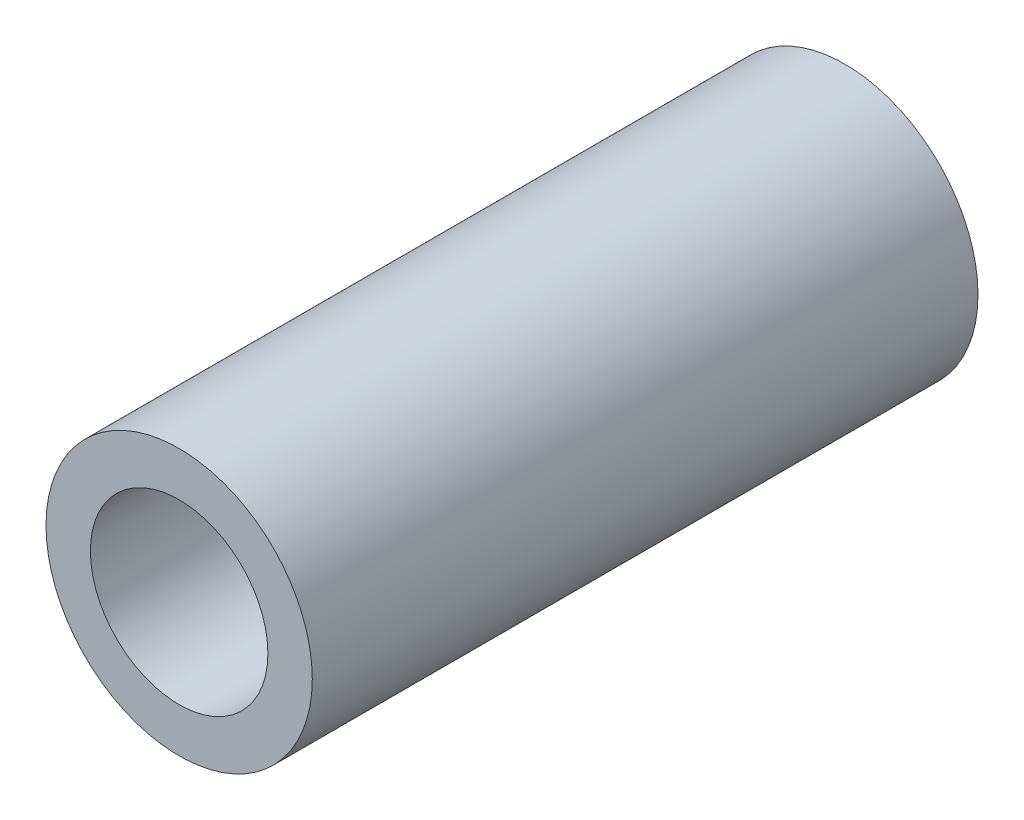
ISO-10303-21;
HEADER;
FILE_DESCRIPTION(('STEP AP214'),'2;1');
FILE_NAME('part.step','',(''),(''),'','','');
FILE_SCHEMA(('AUTOMOTIVE_DESIGN { 1 0 10303 214 1 1 1 1 }'));
ENDSEC;
DATA;
#1=APPLICATION_CONTEXT('core data for automotive mechanical design processes');
#2=APPLICATION_PROTOCOL_DEFINITION('international standard','automotive_design',2000,#1);
#3=PRODUCT_CONTEXT('',#1,'mechanical');
#4=PRODUCT('Part','Part','',(#3));
#5=PRODUCT_RELATED_PRODUCT_CATEGORY('part','',(#4));
#6=PRODUCT_DEFINITION_FORMATION('','',#4);
#7=PRODUCT_DEFINITION_CONTEXT('part definition',#1,'design');
#8=PRODUCT_DEFINITION('design','',#6,#7);
#9=PRODUCT_DEFINITION_SHAPE('','',#8);
#10=(LENGTH_UNIT() NAMED_UNIT(*) SI_UNIT(.MILLI.,.METRE.));
#11=(NAMED_UNIT(*) PLANE_ANGLE_UNIT() SI_UNIT($,.RADIAN.));
#12=(NAMED_UNIT(*) SI_UNIT($,.STERADIAN.) SOLID_ANGLE_UNIT());
#13=UNCERTAINTY_MEASURE_WITH_UNIT(LENGTH_MEASURE(1.E-05),#10,'distance_accuracy_value','');
#14=(GEOMETRIC_REPRESENTATION_CONTEXT(3) GLOBAL_UNCERTAINTY_ASSIGNED_CONTEXT((#13)) GLOBAL_UNIT_ASSIGNED_CONTEXT((#10,
#11,#12)) REPRESENTATION_CONTEXT('',''));
#15=CARTESIAN_POINT('',(0.,0.,0.));
#16=DIRECTION('',(0.,0.,1.));
#17=DIRECTION('',(1.,0.,0.));
#18=AXIS2_PLACEMENT_3D('',#15,#16,#17);
#19=CARTESIAN_POINT('',(-20.,-9.99999017609959,15.));
#20=DIRECTION('',(0.,0.,1.));
#21=DIRECTION('',(1.,0.,0.));
#22=AXIS2_PLACEMENT_3D('',#19,#20,#21);
#23=PLANE('',#22);
#24=CARTESIAN_POINT('',(-20.,-9.99999017609959,15.));
#25=DIRECTION('',(0.,0.,1.));
#26=DIRECTION('',(1.,0.,0.));
#27=AXIS2_PLACEMENT_3D('',#24,#25,#26);
#28=CIRCLE('',#27,3.);
#29=CARTESIAN_POINT('',(-17.,-9.99999017609959,15.));
#30=VERTEX_POINT('',#29);
#31=EDGE_CURVE('E10',#30,#30,#28,.T.);
#32=ORIENTED_EDGE('',*,*,#31,.T.);
#33=EDGE_LOOP('',(#32));
#34=FACE_BOUND('',#33,.T.);
#35=CARTESIAN_POINT('',(-20.,-9.99999017609959,15.));
#36=DIRECTION('',(0.,0.,1.));
#37=DIRECTION('',(1.,0.,0.));
#38=AXIS2_PLACEMENT_3D('',#35,#36,#37);
#39=CIRCLE('',#38,2.);
#40=CARTESIAN_POINT('',(-18.,-9.99999017609959,15.));
#41=VERTEX_POINT('',#40);
#42=EDGE_CURVE('E42',#41,#41,#39,.T.);
#43=ORIENTED_EDGE('',*,*,#42,.F.);
#44=EDGE_LOOP('',(#43));
#45=FACE_BOUND('',#44,.T.);
#46=ADVANCED_FACE('F31',(#34,#45),#23,.T.);
#47=CARTESIAN_POINT('',(-20.,-9.99999017609959,0.));
#48=DIRECTION('',(0.,0.,1.));
#49=DIRECTION('',(1.,0.,0.));
#50=AXIS2_PLACEMENT_3D('',#47,#48,#49);
#51=PLANE('',#50);
#52=CARTESIAN_POINT('',(-20.,-9.99999017609959,0.));
#53=DIRECTION('',(0.,0.,1.));
#54=DIRECTION('',(1.,0.,0.));
#55=AXIS2_PLACEMENT_3D('',#52,#53,#54);
#56=CIRCLE('',#55,3.);
#57=CARTESIAN_POINT('',(-17.,-9.99999017609959,0.));
#58=VERTEX_POINT('',#57);
#59=EDGE_CURVE('E35',#58,#58,#56,.T.);
#60=ORIENTED_EDGE('',*,*,#59,.F.);
#61=EDGE_LOOP('',(#60));
#62=FACE_BOUND('',#61,.T.);
#63=CARTESIAN_POINT('',(-20.,-9.99999017609959,0.));
#64=DIRECTION('',(0.,0.,1.));
#65=DIRECTION('',(1.,0.,0.));
#66=AXIS2_PLACEMENT_3D('',#63,#64,#65);
#67=CIRCLE('',#66,2.);
#68=CARTESIAN_POINT('',(-18.,-9.99999017609959,0.));
#69=VERTEX_POINT('',#68);
#70=EDGE_CURVE('E44',#69,#69,#67,.T.);
#71=ORIENTED_EDGE('',*,*,#70,.T.);
#72=EDGE_LOOP('',(#71));
#73=FACE_BOUND('',#72,.T.);
#74=ADVANCED_FACE('F54',(#62,#73),#51,.F.);
#75=CARTESIAN_POINT('',(-20.,-9.99999017609959,15.));
#76=DIRECTION('',(0.,0.,-1.));
#77=DIRECTION('',(-1.,0.,0.));
#78=AXIS2_PLACEMENT_3D('',#75,#76,#77);
#79=CYLINDRICAL_SURFACE('',#78,3.);
#80=ORIENTED_EDGE('',*,*,#31,.F.);
#81=EDGE_LOOP('',(#80));
#82=FACE_BOUND('',#81,.T.);
#83=ORIENTED_EDGE('',*,*,#59,.T.);
#84=EDGE_LOOP('',(#83));
#85=FACE_BOUND('',#84,.T.);
#86=ADVANCED_FACE('F33',(#82,#85),#79,.T.);
#87=CARTESIAN_POINT('',(-20.,-9.99999017609959,15.));
#88=DIRECTION('',(0.,0.,-1.));
#89=DIRECTION('',(-1.,0.,0.));
#90=AXIS2_PLACEMENT_3D('',#87,#88,#89);
#91=CYLINDRICAL_SURFACE('',#90,2.);
#92=ORIENTED_EDGE('',*,*,#42,.T.);
#93=EDGE_LOOP('',(#92));
#94=FACE_BOUND('',#93,.T.);
#95=ORIENTED_EDGE('',*,*,#70,.F.);
#96=EDGE_LOOP('',(#95));
#97=FACE_BOUND('',#96,.T.);
#98=ADVANCED_FACE('F50',(#94,#97),#91,.F.);
#99=CLOSED_SHELL('',(#46,#74,#86,#98));
#100=MANIFOLD_SOLID_BREP('B2',#99);
#101=ADVANCED_BREP_SHAPE_REPRESENTATION('',(#18,#100),#14);
#102=SHAPE_DEFINITION_REPRESENTATION(#9,#101);
ENDSEC;
END-ISO-10303-21;
